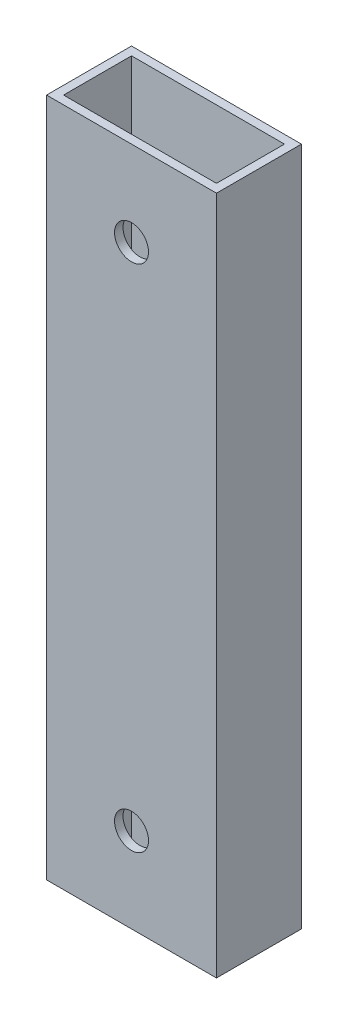
ISO-10303-21;
HEADER;
FILE_DESCRIPTION(('STEP AP214'),'2;1');
FILE_NAME('part.step','',(''),(''),'','','');
FILE_SCHEMA(('AUTOMOTIVE_DESIGN { 1 0 10303 214 1 1 1 1 }'));
ENDSEC;
DATA;
#1=APPLICATION_CONTEXT('core data for automotive mechanical design processes');
#2=APPLICATION_PROTOCOL_DEFINITION('international standard','automotive_design',2000,#1);
#3=PRODUCT_CONTEXT('',#1,'mechanical');
#4=PRODUCT('Part','Part','',(#3));
#5=PRODUCT_RELATED_PRODUCT_CATEGORY('part','',(#4));
#6=PRODUCT_DEFINITION_FORMATION('','',#4);
#7=PRODUCT_DEFINITION_CONTEXT('part definition',#1,'design');
#8=PRODUCT_DEFINITION('design','',#6,#7);
#9=PRODUCT_DEFINITION_SHAPE('','',#8);
#10=(LENGTH_UNIT() NAMED_UNIT(*) SI_UNIT(.MILLI.,.METRE.));
#11=(NAMED_UNIT(*) PLANE_ANGLE_UNIT() SI_UNIT($,.RADIAN.));
#12=(NAMED_UNIT(*) SI_UNIT($,.STERADIAN.) SOLID_ANGLE_UNIT());
#13=UNCERTAINTY_MEASURE_WITH_UNIT(LENGTH_MEASURE(1.E-05),#10,'distance_accuracy_value','');
#14=(GEOMETRIC_REPRESENTATION_CONTEXT(3) GLOBAL_UNCERTAINTY_ASSIGNED_CONTEXT((#13)) GLOBAL_UNIT_ASSIGNED_CONTEXT((#10,
#11,#12)) REPRESENTATION_CONTEXT('',''));
#15=CARTESIAN_POINT('',(0.,0.,0.));
#16=DIRECTION('',(0.,0.,1.));
#17=DIRECTION('',(1.,0.,0.));
#18=AXIS2_PLACEMENT_3D('',#15,#16,#17);
#19=CARTESIAN_POINT('',(0.,80.,0.));
#20=DIRECTION('',(0.,1.,0.));
#21=DIRECTION('',(0.,0.,1.));
#22=AXIS2_PLACEMENT_3D('',#19,#20,#21);
#23=PLANE('',#22);
#24=DIRECTION('',(0.,0.,-1.));
#25=VECTOR('',#24,1.);
#26=CARTESIAN_POINT('',(10.,80.,-5.));
#27=LINE('',#26,#25);
#28=CARTESIAN_POINT('',(10.,80.,5.));
#29=VERTEX_POINT('',#28);
#30=CARTESIAN_POINT('',(10.,80.,-5.));
#31=VERTEX_POINT('',#30);
#32=EDGE_CURVE('E139',#29,#31,#27,.T.);
#33=ORIENTED_EDGE('',*,*,#32,.T.);
#34=DIRECTION('',(-1.,0.,0.));
#35=VECTOR('',#34,1.);
#36=CARTESIAN_POINT('',(-10.,80.,-5.));
#37=LINE('',#36,#35);
#38=CARTESIAN_POINT('',(-10.,80.,-5.));
#39=VERTEX_POINT('',#38);
#40=EDGE_CURVE('E142',#31,#39,#37,.T.);
#41=ORIENTED_EDGE('',*,*,#40,.T.);
#42=DIRECTION('',(0.,0.,1.));
#43=VECTOR('',#42,1.);
#44=CARTESIAN_POINT('',(-10.,80.,-5.));
#45=LINE('',#44,#43);
#46=CARTESIAN_POINT('',(-10.,80.,5.));
#47=VERTEX_POINT('',#46);
#48=EDGE_CURVE('E145',#39,#47,#45,.T.);
#49=ORIENTED_EDGE('',*,*,#48,.T.);
#50=DIRECTION('',(1.,0.,0.));
#51=VECTOR('',#50,1.);
#52=CARTESIAN_POINT('',(-10.,80.,5.));
#53=LINE('',#52,#51);
#54=EDGE_CURVE('E147',#47,#29,#53,.T.);
#55=ORIENTED_EDGE('',*,*,#54,.T.);
#56=EDGE_LOOP('',(#33,#41,#49,#55));
#57=FACE_BOUND('',#56,.T.);
#58=DIRECTION('',(0.,0.,1.));
#59=VECTOR('',#58,1.);
#60=CARTESIAN_POINT('',(-9.00000000000001,80.,-4.));
#61=LINE('',#60,#59);
#62=CARTESIAN_POINT('',(-9.00000000000001,80.,-4.));
#63=VERTEX_POINT('',#62);
#64=CARTESIAN_POINT('',(-9.00000000000001,80.,4.));
#65=VERTEX_POINT('',#64);
#66=EDGE_CURVE('E109',#63,#65,#61,.T.);
#67=ORIENTED_EDGE('',*,*,#66,.F.);
#68=DIRECTION('',(-1.,0.,0.));
#69=VECTOR('',#68,1.);
#70=CARTESIAN_POINT('',(-9.00000000000001,80.,-4.));
#71=LINE('',#70,#69);
#72=CARTESIAN_POINT('',(9.,80.,-4.));
#73=VERTEX_POINT('',#72);
#74=EDGE_CURVE('E101',#73,#63,#71,.T.);
#75=ORIENTED_EDGE('',*,*,#74,.F.);
#76=DIRECTION('',(0.,0.,-1.));
#77=VECTOR('',#76,1.);
#78=CARTESIAN_POINT('',(9.,80.,-4.));
#79=LINE('',#78,#77);
#80=CARTESIAN_POINT('',(9.,80.,4.));
#81=VERTEX_POINT('',#80);
#82=EDGE_CURVE('E123',#81,#73,#79,.T.);
#83=ORIENTED_EDGE('',*,*,#82,.F.);
#84=DIRECTION('',(1.,0.,0.));
#85=VECTOR('',#84,1.);
#86=CARTESIAN_POINT('',(-9.00000000000001,80.,4.));
#87=LINE('',#86,#85);
#88=EDGE_CURVE('E121',#65,#81,#87,.T.);
#89=ORIENTED_EDGE('',*,*,#88,.F.);
#90=EDGE_LOOP('',(#67,#75,#83,#89));
#91=FACE_BOUND('',#90,.T.);
#92=ADVANCED_FACE('F34',(#57,#91),#23,.T.);
#93=CARTESIAN_POINT('',(0.,0.,0.));
#94=DIRECTION('',(0.,1.,0.));
#95=DIRECTION('',(0.,0.,1.));
#96=AXIS2_PLACEMENT_3D('',#93,#94,#95);
#97=PLANE('',#96);
#98=DIRECTION('',(0.,0.,-1.));
#99=VECTOR('',#98,1.);
#100=CARTESIAN_POINT('',(10.,0.,-5.));
#101=LINE('',#100,#99);
#102=CARTESIAN_POINT('',(10.,0.,5.));
#103=VERTEX_POINT('',#102);
#104=CARTESIAN_POINT('',(10.,0.,-5.));
#105=VERTEX_POINT('',#104);
#106=EDGE_CURVE('E117',#103,#105,#101,.T.);
#107=ORIENTED_EDGE('',*,*,#106,.F.);
#108=DIRECTION('',(1.,0.,0.));
#109=VECTOR('',#108,1.);
#110=CARTESIAN_POINT('',(-10.,0.,5.));
#111=LINE('',#110,#109);
#112=CARTESIAN_POINT('',(-10.,0.,5.));
#113=VERTEX_POINT('',#112);
#114=EDGE_CURVE('E143',#113,#103,#111,.T.);
#115=ORIENTED_EDGE('',*,*,#114,.F.);
#116=DIRECTION('',(0.,0.,1.));
#117=VECTOR('',#116,1.);
#118=CARTESIAN_POINT('',(-10.,0.,-5.));
#119=LINE('',#118,#117);
#120=CARTESIAN_POINT('',(-10.,0.,-5.));
#121=VERTEX_POINT('',#120);
#122=EDGE_CURVE('E154',#121,#113,#119,.T.);
#123=ORIENTED_EDGE('',*,*,#122,.F.);
#124=DIRECTION('',(-1.,0.,0.));
#125=VECTOR('',#124,1.);
#126=CARTESIAN_POINT('',(-10.,0.,-5.));
#127=LINE('',#126,#125);
#128=EDGE_CURVE('E152',#105,#121,#127,.T.);
#129=ORIENTED_EDGE('',*,*,#128,.F.);
#130=EDGE_LOOP('',(#107,#115,#123,#129));
#131=FACE_BOUND('',#130,.T.);
#132=DIRECTION('',(-1.,0.,0.));
#133=VECTOR('',#132,1.);
#134=CARTESIAN_POINT('',(-9.00000000000001,0.,-4.));
#135=LINE('',#134,#133);
#136=CARTESIAN_POINT('',(9.,0.,-4.));
#137=VERTEX_POINT('',#136);
#138=CARTESIAN_POINT('',(-9.00000000000001,0.,-4.));
#139=VERTEX_POINT('',#138);
#140=EDGE_CURVE('E59',#137,#139,#135,.T.);
#141=ORIENTED_EDGE('',*,*,#140,.T.);
#142=DIRECTION('',(0.,0.,1.));
#143=VECTOR('',#142,1.);
#144=CARTESIAN_POINT('',(-9.00000000000001,0.,-4.));
#145=LINE('',#144,#143);
#146=CARTESIAN_POINT('',(-9.00000000000001,0.,4.));
#147=VERTEX_POINT('',#146);
#148=EDGE_CURVE('E116',#139,#147,#145,.T.);
#149=ORIENTED_EDGE('',*,*,#148,.T.);
#150=DIRECTION('',(1.,0.,0.));
#151=VECTOR('',#150,1.);
#152=CARTESIAN_POINT('',(-9.00000000000001,0.,4.));
#153=LINE('',#152,#151);
#154=CARTESIAN_POINT('',(9.,0.,4.));
#155=VERTEX_POINT('',#154);
#156=EDGE_CURVE('E131',#147,#155,#153,.T.);
#157=ORIENTED_EDGE('',*,*,#156,.T.);
#158=DIRECTION('',(0.,0.,-1.));
#159=VECTOR('',#158,1.);
#160=CARTESIAN_POINT('',(9.,0.,-4.));
#161=LINE('',#160,#159);
#162=EDGE_CURVE('E110',#155,#137,#161,.T.);
#163=ORIENTED_EDGE('',*,*,#162,.T.);
#164=EDGE_LOOP('',(#141,#149,#157,#163));
#165=FACE_BOUND('',#164,.T.);
#166=ADVANCED_FACE('F204',(#131,#165),#97,.F.);
#167=CARTESIAN_POINT('',(10.,80.,-5.));
#168=DIRECTION('',(-1.,0.,0.));
#169=DIRECTION('',(0.,0.,1.));
#170=AXIS2_PLACEMENT_3D('',#167,#168,#169);
#171=PLANE('',#170);
#172=ORIENTED_EDGE('',*,*,#106,.T.);
#173=DIRECTION('',(0.,-1.,0.));
#174=VECTOR('',#173,1.);
#175=CARTESIAN_POINT('',(10.,80.,-5.));
#176=LINE('',#175,#174);
#177=EDGE_CURVE('E11',#31,#105,#176,.T.);
#178=ORIENTED_EDGE('',*,*,#177,.F.);
#179=ORIENTED_EDGE('',*,*,#32,.F.);
#180=DIRECTION('',(0.,-1.,0.));
#181=VECTOR('',#180,1.);
#182=CARTESIAN_POINT('',(10.,80.,5.));
#183=LINE('',#182,#181);
#184=EDGE_CURVE('E149',#29,#103,#183,.T.);
#185=ORIENTED_EDGE('',*,*,#184,.T.);
#186=EDGE_LOOP('',(#172,#178,#179,#185));
#187=FACE_BOUND('',#186,.T.);
#188=ADVANCED_FACE('F36',(#187),#171,.F.);
#189=CARTESIAN_POINT('',(-10.,80.,-5.));
#190=DIRECTION('',(0.,0.,1.));
#191=DIRECTION('',(1.,0.,0.));
#192=AXIS2_PLACEMENT_3D('',#189,#190,#191);
#193=PLANE('',#192);
#194=CARTESIAN_POINT('',(0.,10.,-5.));
#195=DIRECTION('',(0.,0.,-1.));
#196=DIRECTION('',(-1.,0.,0.));
#197=AXIS2_PLACEMENT_3D('',#194,#195,#196);
#198=CIRCLE('',#197,2.);
#199=CARTESIAN_POINT('',(-2.,10.,-5.));
#200=VERTEX_POINT('',#199);
#201=EDGE_CURVE('E183',#200,#200,#198,.T.);
#202=ORIENTED_EDGE('',*,*,#201,.F.);
#203=EDGE_LOOP('',(#202));
#204=FACE_BOUND('',#203,.T.);
#205=CARTESIAN_POINT('',(0.,70.,-5.));
#206=DIRECTION('',(0.,0.,-1.));
#207=DIRECTION('',(-1.,0.,0.));
#208=AXIS2_PLACEMENT_3D('',#205,#206,#207);
#209=CIRCLE('',#208,2.);
#210=CARTESIAN_POINT('',(-2.,70.,-5.));
#211=VERTEX_POINT('',#210);
#212=EDGE_CURVE('E170',#211,#211,#209,.T.);
#213=ORIENTED_EDGE('',*,*,#212,.F.);
#214=EDGE_LOOP('',(#213));
#215=FACE_BOUND('',#214,.T.);
#216=ORIENTED_EDGE('',*,*,#128,.T.);
#217=DIRECTION('',(0.,-1.,0.));
#218=VECTOR('',#217,1.);
#219=CARTESIAN_POINT('',(-10.,80.,-5.));
#220=LINE('',#219,#218);
#221=EDGE_CURVE('E43',#39,#121,#220,.T.);
#222=ORIENTED_EDGE('',*,*,#221,.F.);
#223=ORIENTED_EDGE('',*,*,#40,.F.);
#224=ORIENTED_EDGE('',*,*,#177,.T.);
#225=EDGE_LOOP('',(#216,#222,#223,#224));
#226=FACE_BOUND('',#225,.T.);
#227=ADVANCED_FACE('F189',(#204,#215,#226),#193,.F.);
#228=CARTESIAN_POINT('',(-10.,80.,-5.));
#229=DIRECTION('',(1.,0.,0.));
#230=DIRECTION('',(0.,0.,-1.));
#231=AXIS2_PLACEMENT_3D('',#228,#229,#230);
#232=PLANE('',#231);
#233=ORIENTED_EDGE('',*,*,#122,.T.);
#234=DIRECTION('',(0.,-1.,0.));
#235=VECTOR('',#234,1.);
#236=CARTESIAN_POINT('',(-10.,80.,5.));
#237=LINE('',#236,#235);
#238=EDGE_CURVE('E159',#47,#113,#237,.T.);
#239=ORIENTED_EDGE('',*,*,#238,.F.);
#240=ORIENTED_EDGE('',*,*,#48,.F.);
#241=ORIENTED_EDGE('',*,*,#221,.T.);
#242=EDGE_LOOP('',(#233,#239,#240,#241));
#243=FACE_BOUND('',#242,.T.);
#244=ADVANCED_FACE('F192',(#243),#232,.F.);
#245=CARTESIAN_POINT('',(-10.,80.,5.));
#246=DIRECTION('',(0.,0.,-1.));
#247=DIRECTION('',(-1.,0.,0.));
#248=AXIS2_PLACEMENT_3D('',#245,#246,#247);
#249=PLANE('',#248);
#250=CARTESIAN_POINT('',(0.,10.,5.));
#251=DIRECTION('',(0.,0.,-1.));
#252=DIRECTION('',(-1.,0.,0.));
#253=AXIS2_PLACEMENT_3D('',#250,#251,#252);
#254=CIRCLE('',#253,2.);
#255=CARTESIAN_POINT('',(-2.,10.,5.));
#256=VERTEX_POINT('',#255);
#257=EDGE_CURVE('E180',#256,#256,#254,.T.);
#258=ORIENTED_EDGE('',*,*,#257,.T.);
#259=EDGE_LOOP('',(#258));
#260=FACE_BOUND('',#259,.T.);
#261=CARTESIAN_POINT('',(0.,70.,5.));
#262=DIRECTION('',(0.,0.,-1.));
#263=DIRECTION('',(-1.,0.,0.));
#264=AXIS2_PLACEMENT_3D('',#261,#262,#263);
#265=CIRCLE('',#264,2.);
#266=CARTESIAN_POINT('',(-2.,70.,5.));
#267=VERTEX_POINT('',#266);
#268=EDGE_CURVE('E165',#267,#267,#265,.T.);
#269=ORIENTED_EDGE('',*,*,#268,.T.);
#270=EDGE_LOOP('',(#269));
#271=FACE_BOUND('',#270,.T.);
#272=ORIENTED_EDGE('',*,*,#114,.T.);
#273=ORIENTED_EDGE('',*,*,#184,.F.);
#274=ORIENTED_EDGE('',*,*,#54,.F.);
#275=ORIENTED_EDGE('',*,*,#238,.T.);
#276=EDGE_LOOP('',(#272,#273,#274,#275));
#277=FACE_BOUND('',#276,.T.);
#278=ADVANCED_FACE('F208',(#260,#271,#277),#249,.F.);
#279=CARTESIAN_POINT('',(-9.00000000000001,80.,-4.));
#280=DIRECTION('',(0.,0.,1.));
#281=DIRECTION('',(1.,0.,0.));
#282=AXIS2_PLACEMENT_3D('',#279,#280,#281);
#283=PLANE('',#282);
#284=CARTESIAN_POINT('',(0.,10.,-4.));
#285=DIRECTION('',(0.,0.,1.));
#286=DIRECTION('',(1.,0.,0.));
#287=AXIS2_PLACEMENT_3D('',#284,#285,#286);
#288=CIRCLE('',#287,2.);
#289=CARTESIAN_POINT('',(2.,10.,-4.));
#290=VERTEX_POINT('',#289);
#291=EDGE_CURVE('E175',#290,#290,#288,.T.);
#292=ORIENTED_EDGE('',*,*,#291,.F.);
#293=EDGE_LOOP('',(#292));
#294=FACE_BOUND('',#293,.T.);
#295=CARTESIAN_POINT('',(0.,70.,-4.));
#296=DIRECTION('',(0.,0.,1.));
#297=DIRECTION('',(1.,0.,0.));
#298=AXIS2_PLACEMENT_3D('',#295,#296,#297);
#299=CIRCLE('',#298,2.);
#300=CARTESIAN_POINT('',(2.,70.,-4.));
#301=VERTEX_POINT('',#300);
#302=EDGE_CURVE('E129',#301,#301,#299,.T.);
#303=ORIENTED_EDGE('',*,*,#302,.F.);
#304=EDGE_LOOP('',(#303));
#305=FACE_BOUND('',#304,.T.);
#306=ORIENTED_EDGE('',*,*,#140,.F.);
#307=DIRECTION('',(0.,-1.,0.));
#308=VECTOR('',#307,1.);
#309=CARTESIAN_POINT('',(9.,80.,-4.));
#310=LINE('',#309,#308);
#311=EDGE_CURVE('E105',#73,#137,#310,.T.);
#312=ORIENTED_EDGE('',*,*,#311,.F.);
#313=ORIENTED_EDGE('',*,*,#74,.T.);
#314=DIRECTION('',(0.,-1.,0.));
#315=VECTOR('',#314,1.);
#316=CARTESIAN_POINT('',(-9.00000000000001,80.,-4.));
#317=LINE('',#316,#315);
#318=EDGE_CURVE('E104',#63,#139,#317,.T.);
#319=ORIENTED_EDGE('',*,*,#318,.T.);
#320=EDGE_LOOP('',(#306,#312,#313,#319));
#321=FACE_BOUND('',#320,.T.);
#322=ADVANCED_FACE('F103',(#294,#305,#321),#283,.T.);
#323=CARTESIAN_POINT('',(-9.00000000000001,80.,-4.));
#324=DIRECTION('',(1.,0.,0.));
#325=DIRECTION('',(0.,0.,-1.));
#326=AXIS2_PLACEMENT_3D('',#323,#324,#325);
#327=PLANE('',#326);
#328=ORIENTED_EDGE('',*,*,#148,.F.);
#329=ORIENTED_EDGE('',*,*,#318,.F.);
#330=ORIENTED_EDGE('',*,*,#66,.T.);
#331=DIRECTION('',(0.,-1.,0.));
#332=VECTOR('',#331,1.);
#333=CARTESIAN_POINT('',(-9.00000000000001,80.,4.));
#334=LINE('',#333,#332);
#335=EDGE_CURVE('E118',#65,#147,#334,.T.);
#336=ORIENTED_EDGE('',*,*,#335,.T.);
#337=EDGE_LOOP('',(#328,#329,#330,#336));
#338=FACE_BOUND('',#337,.T.);
#339=ADVANCED_FACE('F113',(#338),#327,.T.);
#340=CARTESIAN_POINT('',(-9.00000000000001,80.,4.));
#341=DIRECTION('',(0.,0.,-1.));
#342=DIRECTION('',(-1.,0.,0.));
#343=AXIS2_PLACEMENT_3D('',#340,#341,#342);
#344=PLANE('',#343);
#345=CARTESIAN_POINT('',(0.,10.,4.));
#346=DIRECTION('',(0.,0.,-1.));
#347=DIRECTION('',(-1.,0.,0.));
#348=AXIS2_PLACEMENT_3D('',#345,#346,#347);
#349=CIRCLE('',#348,2.);
#350=CARTESIAN_POINT('',(-2.,10.,4.));
#351=VERTEX_POINT('',#350);
#352=EDGE_CURVE('E38',#351,#351,#349,.T.);
#353=ORIENTED_EDGE('',*,*,#352,.F.);
#354=EDGE_LOOP('',(#353));
#355=FACE_BOUND('',#354,.T.);
#356=CARTESIAN_POINT('',(0.,70.,4.));
#357=DIRECTION('',(0.,0.,-1.));
#358=DIRECTION('',(-1.,0.,0.));
#359=AXIS2_PLACEMENT_3D('',#356,#357,#358);
#360=CIRCLE('',#359,2.);
#361=CARTESIAN_POINT('',(-2.,70.,4.));
#362=VERTEX_POINT('',#361);
#363=EDGE_CURVE('E163',#362,#362,#360,.T.);
#364=ORIENTED_EDGE('',*,*,#363,.F.);
#365=EDGE_LOOP('',(#364));
#366=FACE_BOUND('',#365,.T.);
#367=ORIENTED_EDGE('',*,*,#156,.F.);
#368=ORIENTED_EDGE('',*,*,#335,.F.);
#369=ORIENTED_EDGE('',*,*,#88,.T.);
#370=DIRECTION('',(0.,-1.,0.));
#371=VECTOR('',#370,1.);
#372=CARTESIAN_POINT('',(9.,80.,4.));
#373=LINE('',#372,#371);
#374=EDGE_CURVE('E51',#81,#155,#373,.T.);
#375=ORIENTED_EDGE('',*,*,#374,.T.);
#376=EDGE_LOOP('',(#367,#368,#369,#375));
#377=FACE_BOUND('',#376,.T.);
#378=ADVANCED_FACE('F249',(#355,#366,#377),#344,.T.);
#379=CARTESIAN_POINT('',(9.,80.,-4.));
#380=DIRECTION('',(-1.,0.,0.));
#381=DIRECTION('',(0.,0.,1.));
#382=AXIS2_PLACEMENT_3D('',#379,#380,#381);
#383=PLANE('',#382);
#384=ORIENTED_EDGE('',*,*,#162,.F.);
#385=ORIENTED_EDGE('',*,*,#374,.F.);
#386=ORIENTED_EDGE('',*,*,#82,.T.);
#387=ORIENTED_EDGE('',*,*,#311,.T.);
#388=EDGE_LOOP('',(#384,#385,#386,#387));
#389=FACE_BOUND('',#388,.T.);
#390=ADVANCED_FACE('F255',(#389),#383,.T.);
#391=CARTESIAN_POINT('',(0.,70.,-5.));
#392=DIRECTION('',(0.,0.,-1.));
#393=DIRECTION('',(-1.,0.,0.));
#394=AXIS2_PLACEMENT_3D('',#391,#392,#393);
#395=CYLINDRICAL_SURFACE('',#394,2.);
#396=ORIENTED_EDGE('',*,*,#363,.T.);
#397=EDGE_LOOP('',(#396));
#398=FACE_BOUND('',#397,.T.);
#399=ORIENTED_EDGE('',*,*,#268,.F.);
#400=EDGE_LOOP('',(#399));
#401=FACE_BOUND('',#400,.T.);
#402=ADVANCED_FACE('F263',(#398,#401),#395,.F.);
#403=ORIENTED_EDGE('',*,*,#302,.T.);
#404=EDGE_LOOP('',(#403));
#405=FACE_BOUND('',#404,.T.);
#406=ORIENTED_EDGE('',*,*,#212,.T.);
#407=EDGE_LOOP('',(#406));
#408=FACE_BOUND('',#407,.T.);
#409=ADVANCED_FACE('F269',(#405,#408),#395,.F.);
#410=CARTESIAN_POINT('',(0.,10.,-5.));
#411=DIRECTION('',(0.,0.,-1.));
#412=DIRECTION('',(-1.,0.,0.));
#413=AXIS2_PLACEMENT_3D('',#410,#411,#412);
#414=CYLINDRICAL_SURFACE('',#413,2.);
#415=ORIENTED_EDGE('',*,*,#352,.T.);
#416=EDGE_LOOP('',(#415));
#417=FACE_BOUND('',#416,.T.);
#418=ORIENTED_EDGE('',*,*,#257,.F.);
#419=EDGE_LOOP('',(#418));
#420=FACE_BOUND('',#419,.T.);
#421=ADVANCED_FACE('F276',(#417,#420),#414,.F.);
#422=ORIENTED_EDGE('',*,*,#291,.T.);
#423=EDGE_LOOP('',(#422));
#424=FACE_BOUND('',#423,.T.);
#425=ORIENTED_EDGE('',*,*,#201,.T.);
#426=EDGE_LOOP('',(#425));
#427=FACE_BOUND('',#426,.T.);
#428=ADVANCED_FACE('F187',(#424,#427),#414,.F.);
#429=CLOSED_SHELL('',(#92,#166,#188,#227,#244,#278,#322,#339,#378,#390,#402,#409,#421,#428));
#430=MANIFOLD_SOLID_BREP('B2',#429);
#431=ADVANCED_BREP_SHAPE_REPRESENTATION('',(#18,#430),#14);
#432=SHAPE_DEFINITION_REPRESENTATION(#9,#431);
ENDSEC;
END-ISO-10303-21;
